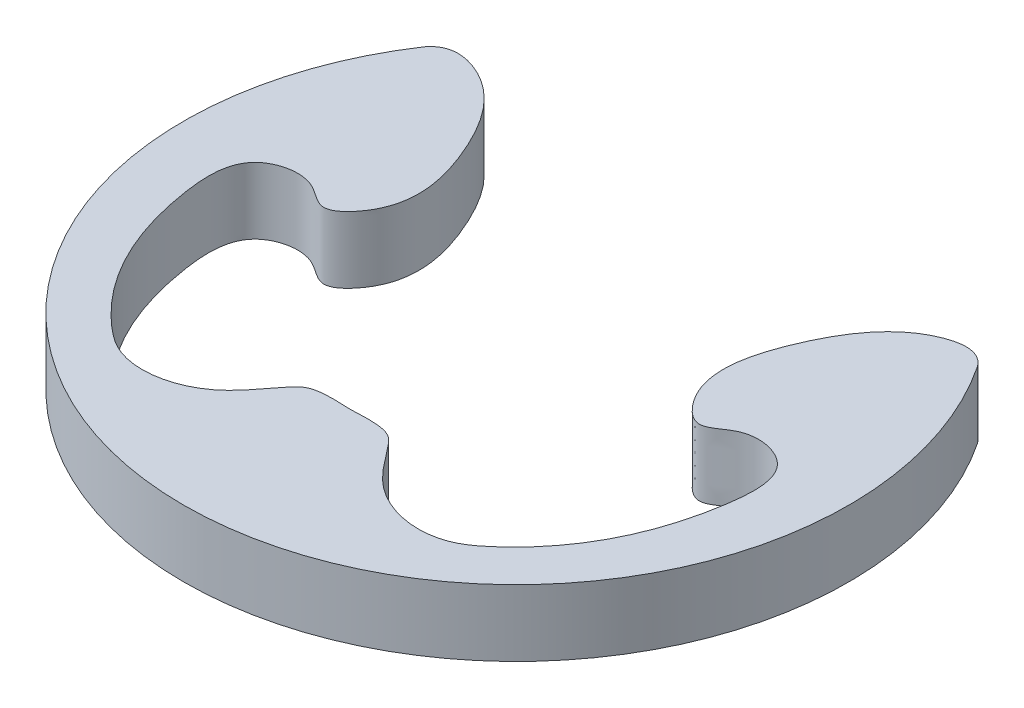
ISO-10303-21;
HEADER;
FILE_DESCRIPTION(('STEP AP214'),'2;1');
FILE_NAME('part.step','',(''),(''),'','','');
FILE_SCHEMA(('AUTOMOTIVE_DESIGN { 1 0 10303 214 1 1 1 1 }'));
ENDSEC;
DATA;
#1=APPLICATION_CONTEXT('core data for automotive mechanical design processes');
#2=APPLICATION_PROTOCOL_DEFINITION('international standard','automotive_design',2000,#1);
#3=PRODUCT_CONTEXT('',#1,'mechanical');
#4=PRODUCT('Part','Part','',(#3));
#5=PRODUCT_RELATED_PRODUCT_CATEGORY('part','',(#4));
#6=PRODUCT_DEFINITION_FORMATION('','',#4);
#7=PRODUCT_DEFINITION_CONTEXT('part definition',#1,'design');
#8=PRODUCT_DEFINITION('design','',#6,#7);
#9=PRODUCT_DEFINITION_SHAPE('','',#8);
#10=(LENGTH_UNIT() NAMED_UNIT(*) SI_UNIT(.MILLI.,.METRE.));
#11=(NAMED_UNIT(*) PLANE_ANGLE_UNIT() SI_UNIT($,.RADIAN.));
#12=(NAMED_UNIT(*) SI_UNIT($,.STERADIAN.) SOLID_ANGLE_UNIT());
#13=UNCERTAINTY_MEASURE_WITH_UNIT(LENGTH_MEASURE(1.E-05),#10,'distance_accuracy_value','');
#14=(GEOMETRIC_REPRESENTATION_CONTEXT(3) GLOBAL_UNCERTAINTY_ASSIGNED_CONTEXT((#13)) GLOBAL_UNIT_ASSIGNED_CONTEXT((#10,
#11,#12)) REPRESENTATION_CONTEXT('',''));
#15=CARTESIAN_POINT('',(0.,0.,0.));
#16=DIRECTION('',(0.,0.,1.));
#17=DIRECTION('',(1.,0.,0.));
#18=AXIS2_PLACEMENT_3D('',#15,#16,#17);
#19=CARTESIAN_POINT('',(0.,0.4,0.));
#20=DIRECTION('',(0.,-1.,0.));
#21=DIRECTION('',(0.,0.,-1.));
#22=AXIS2_PLACEMENT_3D('',#19,#20,#21);
#23=CYLINDRICAL_SURFACE('',#22,2.);
#24=DIRECTION('',(0.,1.,0.));
#25=VECTOR('',#24,1.);
#26=CARTESIAN_POINT('',(-1.66387063278989,-0.00100000000000002,-1.1097452488474));
#27=LINE('',#26,#25);
#28=CARTESIAN_POINT('',(-1.66387063278989,0.,-1.1097452488474));
#29=VERTEX_POINT('',#28);
#30=CARTESIAN_POINT('',(-1.66387063278989,0.4,-1.1097452488474));
#31=VERTEX_POINT('',#30);
#32=EDGE_CURVE('E77',#29,#31,#27,.T.);
#33=ORIENTED_EDGE('',*,*,#32,.F.);
#34=CARTESIAN_POINT('',(0.,0.,0.));
#35=DIRECTION('',(0.,1.,0.));
#36=DIRECTION('',(0.,0.,1.));
#37=AXIS2_PLACEMENT_3D('',#34,#35,#36);
#38=CIRCLE('',#37,2.);
#39=CARTESIAN_POINT('',(1.66387063279339,0.,-1.10974524884214));
#40=VERTEX_POINT('',#39);
#41=EDGE_CURVE('E35',#29,#40,#38,.T.);
#42=ORIENTED_EDGE('',*,*,#41,.T.);
#43=DIRECTION('',(0.,1.,0.));
#44=VECTOR('',#43,1.);
#45=CARTESIAN_POINT('',(1.66387063279339,-0.00100000000000002,-1.10974524884214));
#46=LINE('',#45,#44);
#47=CARTESIAN_POINT('',(1.66387063279339,0.4,-1.10974524884214));
#48=VERTEX_POINT('',#47);
#49=EDGE_CURVE('E46',#40,#48,#46,.T.);
#50=ORIENTED_EDGE('',*,*,#49,.T.);
#51=CARTESIAN_POINT('',(0.,0.4,0.));
#52=DIRECTION('',(0.,1.,0.));
#53=DIRECTION('',(0.,0.,1.));
#54=AXIS2_PLACEMENT_3D('',#51,#52,#53);
#55=CIRCLE('',#54,2.);
#56=EDGE_CURVE('E11',#31,#48,#55,.T.);
#57=ORIENTED_EDGE('',*,*,#56,.F.);
#58=EDGE_LOOP('',(#33,#42,#50,#57));
#59=FACE_BOUND('',#58,.T.);
#60=ADVANCED_FACE('F32',(#59),#23,.T.);
#61=CARTESIAN_POINT('',(0.,0.4,0.));
#62=DIRECTION('',(0.,1.,0.));
#63=DIRECTION('',(0.,0.,1.));
#64=AXIS2_PLACEMENT_3D('',#61,#62,#63);
#65=PLANE('',#64);
#66=CARTESIAN_POINT('',(0.,0.4,1.));
#67=CARTESIAN_POINT('',(0.208250964654716,0.4,0.988236239681564));
#68=CARTESIAN_POINT('',(0.285688156294142,0.4,1.02516274319363));
#69=CARTESIAN_POINT('',(0.516134817375853,0.4,1.39503429082108));
#70=CARTESIAN_POINT('',(0.91926636645246,0.4,1.46711692685205));
#71=CARTESIAN_POINT('',(1.3832942134546,0.4,1.10548122895137));
#72=CARTESIAN_POINT('',(1.62353256504432,0.4,0.635686702454152));
#73=CARTESIAN_POINT('',(1.66088727227594,0.4,-0.0310211682091904));
#74=CARTESIAN_POINT('',(1.30565381602247,0.4,-0.110584822790635));
#75=CARTESIAN_POINT('',(1.1335581885044,0.4,0.0762213385110614));
#76=CARTESIAN_POINT('',(0.849044475231734,0.4,-0.19239276052432));
#77=CARTESIAN_POINT('',(0.965822076869781,0.4,-0.70348139541722));
#78=CARTESIAN_POINT('',(1.26974875374683,0.4,-1.16156105120231));
#79=CARTESIAN_POINT('',(1.61256870819876,0.4,-1.20211968353707));
#80=CARTESIAN_POINT('',(1.67928899196226,0.4,-1.08627274727592));
#81=B_SPLINE_CURVE_WITH_KNOTS('',3,(#66,#67,#68,#69,#70,#71,#72,#73,#74,#75,#76,#77,#78,#79,
#80),.UNSPECIFIED.,.F.,.F.,(4,1,1,1,1,1,1,1,1,1,1,1,4),(0.,0.0628856925943503,0.124135561130469,
0.231355194489178,0.267285205964287,0.479704211720058,0.555549734124641,0.615510884405595,
0.651079781072618,0.684138155509871,0.81014685733678,0.937553871344105,1.),.UNSPECIFIED.);
#82=CARTESIAN_POINT('',(0.,0.4,1.));
#83=VERTEX_POINT('',#82);
#84=EDGE_CURVE('E70',#83,#48,#81,.T.);
#85=ORIENTED_EDGE('',*,*,#84,.F.);
#86=CARTESIAN_POINT('',(0.,0.4,1.));
#87=CARTESIAN_POINT('',(-0.208250964654715,0.4,0.988236239681564));
#88=CARTESIAN_POINT('',(-0.285688156294141,0.4,1.02516274319363));
#89=CARTESIAN_POINT('',(-0.516134817375852,0.4,1.39503429082108));
#90=CARTESIAN_POINT('',(-0.919266366452459,0.4,1.46711692685205));
#91=CARTESIAN_POINT('',(-1.3832942134546,0.4,1.10548122895138));
#92=CARTESIAN_POINT('',(-1.62353256504432,0.4,0.635686702454152));
#93=CARTESIAN_POINT('',(-1.66088727227594,0.4,-0.03102116820919));
#94=CARTESIAN_POINT('',(-1.30565381602247,0.4,-0.110584822790634));
#95=CARTESIAN_POINT('',(-1.1335581885044,0.4,0.0762213385110617));
#96=CARTESIAN_POINT('',(-0.849044475231733,0.4,-0.19239276052432));
#97=CARTESIAN_POINT('',(-0.965822076869781,0.4,-0.70348139541722));
#98=CARTESIAN_POINT('',(-1.26974875374683,0.4,-1.16156105120231));
#99=CARTESIAN_POINT('',(-1.61256870819876,0.4,-1.20211968353707));
#100=CARTESIAN_POINT('',(-1.67928899196226,0.4,-1.08627274727592));
#101=B_SPLINE_CURVE_WITH_KNOTS('',3,(#86,#87,#88,#89,#90,#91,#92,#93,#94,#95,#96,#97,#98,#99,
#100),.UNSPECIFIED.,.F.,.F.,(4,1,1,1,1,1,1,1,1,1,1,1,4),(0.,0.0628856925943503,
0.124135561130469,0.231355194489178,0.267285205964287,0.479704211720058,0.555549734124641,
0.615510884405595,0.651079781072618,0.684138155509871,0.81014685733678,0.937553871344105,1.),.UNSPECIFIED.);
#102=EDGE_CURVE('E68',#83,#31,#101,.T.);
#103=ORIENTED_EDGE('',*,*,#102,.T.);
#104=ORIENTED_EDGE('',*,*,#56,.T.);
#105=EDGE_LOOP('',(#85,#103,#104));
#106=FACE_BOUND('',#105,.T.);
#107=ADVANCED_FACE('F102',(#106),#65,.T.);
#108=CARTESIAN_POINT('',(0.,0.,0.));
#109=DIRECTION('',(0.,1.,0.));
#110=DIRECTION('',(0.,0.,1.));
#111=AXIS2_PLACEMENT_3D('',#108,#109,#110);
#112=PLANE('',#111);
#113=CARTESIAN_POINT('',(0.,0.,1.));
#114=CARTESIAN_POINT('',(-0.208250964654715,0.,0.988236239681564));
#115=CARTESIAN_POINT('',(-0.285688156294141,0.,1.02516274319363));
#116=CARTESIAN_POINT('',(-0.516134817375852,0.,1.39503429082108));
#117=CARTESIAN_POINT('',(-0.919266366452459,0.,1.46711692685205));
#118=CARTESIAN_POINT('',(-1.3832942134546,0.,1.10548122895138));
#119=CARTESIAN_POINT('',(-1.62353256504432,0.,0.635686702454152));
#120=CARTESIAN_POINT('',(-1.66088727227594,0.,-0.03102116820919));
#121=CARTESIAN_POINT('',(-1.30565381602247,0.,-0.110584822790634));
#122=CARTESIAN_POINT('',(-1.1335581885044,0.,0.0762213385110617));
#123=CARTESIAN_POINT('',(-0.849044475231733,0.,-0.19239276052432));
#124=CARTESIAN_POINT('',(-0.965822076869781,0.,-0.70348139541722));
#125=CARTESIAN_POINT('',(-1.26974875374683,0.,-1.16156105120231));
#126=CARTESIAN_POINT('',(-1.61256870819876,0.,-1.20211968353707));
#127=CARTESIAN_POINT('',(-1.67928899196226,0.,-1.08627274727592));
#128=B_SPLINE_CURVE_WITH_KNOTS('',3,(#113,#114,#115,#116,#117,#118,#119,#120,#121,#122,#123,
#124,#125,#126,#127),.UNSPECIFIED.,.F.,.F.,(4,1,1,1,1,1,1,1,1,1,1,1,4),(0.,0.0628856925943503,
0.124135561130469,0.231355194489178,0.267285205964287,0.479704211720058,0.555549734124641,
0.615510884405595,0.651079781072618,0.684138155509871,0.81014685733678,0.937553871344105,1.),.UNSPECIFIED.);
#129=CARTESIAN_POINT('',(0.,0.,1.));
#130=VERTEX_POINT('',#129);
#131=EDGE_CURVE('E54',#29,#130,#128,.F.);
#132=ORIENTED_EDGE('',*,*,#131,.T.);
#133=CARTESIAN_POINT('',(0.,0.,1.));
#134=CARTESIAN_POINT('',(0.208250964654716,0.,0.988236239681564));
#135=CARTESIAN_POINT('',(0.285688156294142,0.,1.02516274319363));
#136=CARTESIAN_POINT('',(0.516134817375853,0.,1.39503429082108));
#137=CARTESIAN_POINT('',(0.91926636645246,0.,1.46711692685205));
#138=CARTESIAN_POINT('',(1.3832942134546,0.,1.10548122895137));
#139=CARTESIAN_POINT('',(1.62353256504432,0.,0.635686702454152));
#140=CARTESIAN_POINT('',(1.66088727227594,0.,-0.0310211682091904));
#141=CARTESIAN_POINT('',(1.30565381602247,0.,-0.110584822790635));
#142=CARTESIAN_POINT('',(1.1335581885044,0.,0.0762213385110614));
#143=CARTESIAN_POINT('',(0.849044475231734,0.,-0.19239276052432));
#144=CARTESIAN_POINT('',(0.965822076869781,0.,-0.70348139541722));
#145=CARTESIAN_POINT('',(1.26974875374683,0.,-1.16156105120231));
#146=CARTESIAN_POINT('',(1.61256870819876,0.,-1.20211968353707));
#147=CARTESIAN_POINT('',(1.67928899196226,0.,-1.08627274727592));
#148=B_SPLINE_CURVE_WITH_KNOTS('',3,(#133,#134,#135,#136,#137,#138,#139,#140,#141,#142,#143,
#144,#145,#146,#147),.UNSPECIFIED.,.F.,.F.,(4,1,1,1,1,1,1,1,1,1,1,1,4),(0.,0.0628856925943503,
0.124135561130469,0.231355194489178,0.267285205964287,0.479704211720058,0.555549734124641,
0.615510884405595,0.651079781072618,0.684138155509871,0.81014685733678,0.937553871344105,1.),.UNSPECIFIED.);
#149=EDGE_CURVE('E72',#40,#130,#148,.F.);
#150=ORIENTED_EDGE('',*,*,#149,.F.);
#151=ORIENTED_EDGE('',*,*,#41,.F.);
#152=EDGE_LOOP('',(#132,#150,#151));
#153=FACE_BOUND('',#152,.T.);
#154=ADVANCED_FACE('F79',(#153),#112,.F.);
#155=CARTESIAN_POINT('',(0.,-0.00100000000000002,1.));
#156=CARTESIAN_POINT('',(-0.208250964654715,-0.00100000000000002,0.988236239681564));
#157=CARTESIAN_POINT('',(-0.285688156294141,-0.00100000000000002,1.02516274319363));
#158=CARTESIAN_POINT('',(-0.516134817375852,-0.00100000000000002,1.39503429082108));
#159=CARTESIAN_POINT('',(-0.919266366452459,-0.00100000000000002,1.46711692685205));
#160=CARTESIAN_POINT('',(-1.3832942134546,-0.00100000000000002,1.10548122895138));
#161=CARTESIAN_POINT('',(-1.62353256504432,-0.00100000000000002,0.635686702454152));
#162=CARTESIAN_POINT('',(-1.66088727227594,-0.00100000000000002,-0.03102116820919));
#163=CARTESIAN_POINT('',(-1.30565381602247,-0.00100000000000002,-0.110584822790634));
#164=CARTESIAN_POINT('',(-1.1335581885044,-0.00100000000000002,0.0762213385110617));
#165=CARTESIAN_POINT('',(-0.849044475231733,-0.00100000000000002,-0.19239276052432));
#166=CARTESIAN_POINT('',(-0.965822076869781,-0.00100000000000002,-0.70348139541722));
#167=CARTESIAN_POINT('',(-1.26974875374683,-0.00100000000000002,-1.16156105120231));
#168=CARTESIAN_POINT('',(-1.61256870819876,-0.00100000000000002,-1.20211968353707));
#169=CARTESIAN_POINT('',(-1.67928899196226,-0.00100000000000002,-1.08627274727592));
#170=B_SPLINE_CURVE_WITH_KNOTS('',3,(#155,#156,#157,#158,#159,#160,#161,#162,#163,#164,#165,
#166,#167,#168,#169),.UNSPECIFIED.,.F.,.F.,(4,1,1,1,1,1,1,1,1,1,1,1,4),(0.,0.0628856925943503,
0.124135561130469,0.231355194489178,0.267285205964287,0.479704211720058,0.555549734124641,
0.615510884405595,0.651079781072618,0.684138155509871,0.81014685733678,0.937553871344105,1.),.UNSPECIFIED.);
#171=DIRECTION('',(0.,1.,0.));
#172=VECTOR('',#171,1.);
#173=SURFACE_OF_LINEAR_EXTRUSION('',#170,#172);
#174=ORIENTED_EDGE('',*,*,#32,.T.);
#175=ORIENTED_EDGE('',*,*,#102,.F.);
#176=DIRECTION('',(0.,1.,0.));
#177=VECTOR('',#176,1.);
#178=CARTESIAN_POINT('',(0.,-0.00100000000000002,1.));
#179=LINE('',#178,#177);
#180=EDGE_CURVE('E65',#130,#83,#179,.T.);
#181=ORIENTED_EDGE('',*,*,#180,.F.);
#182=ORIENTED_EDGE('',*,*,#131,.F.);
#183=EDGE_LOOP('',(#174,#175,#181,#182));
#184=FACE_BOUND('',#183,.T.);
#185=ADVANCED_FACE('F66',(#184),#173,.T.);
#186=CARTESIAN_POINT('',(0.,-0.00100000000000002,1.));
#187=CARTESIAN_POINT('',(0.208250964654716,-0.00100000000000002,0.988236239681564));
#188=CARTESIAN_POINT('',(0.285688156294142,-0.00100000000000002,1.02516274319363));
#189=CARTESIAN_POINT('',(0.516134817375853,-0.00100000000000002,1.39503429082108));
#190=CARTESIAN_POINT('',(0.91926636645246,-0.00100000000000002,1.46711692685205));
#191=CARTESIAN_POINT('',(1.3832942134546,-0.00100000000000002,1.10548122895137));
#192=CARTESIAN_POINT('',(1.62353256504432,-0.00100000000000002,0.635686702454152));
#193=CARTESIAN_POINT('',(1.66088727227594,-0.00100000000000002,-0.0310211682091904));
#194=CARTESIAN_POINT('',(1.30565381602247,-0.00100000000000002,-0.110584822790635));
#195=CARTESIAN_POINT('',(1.1335581885044,-0.00100000000000002,0.0762213385110614));
#196=CARTESIAN_POINT('',(0.849044475231734,-0.00100000000000002,-0.19239276052432));
#197=CARTESIAN_POINT('',(0.965822076869781,-0.00100000000000002,-0.70348139541722));
#198=CARTESIAN_POINT('',(1.26974875374683,-0.00100000000000002,-1.16156105120231));
#199=CARTESIAN_POINT('',(1.61256870819876,-0.00100000000000002,-1.20211968353707));
#200=CARTESIAN_POINT('',(1.67928899196226,-0.00100000000000002,-1.08627274727592));
#201=B_SPLINE_CURVE_WITH_KNOTS('',3,(#186,#187,#188,#189,#190,#191,#192,#193,#194,#195,#196,
#197,#198,#199,#200),.UNSPECIFIED.,.F.,.F.,(4,1,1,1,1,1,1,1,1,1,1,1,4),(0.,0.0628856925943503,
0.124135561130469,0.231355194489178,0.267285205964287,0.479704211720058,0.555549734124641,
0.615510884405595,0.651079781072618,0.684138155509871,0.81014685733678,0.937553871344105,1.),.UNSPECIFIED.);
#202=DIRECTION('',(0.,1.,0.));
#203=VECTOR('',#202,1.);
#204=SURFACE_OF_LINEAR_EXTRUSION('',#201,#203);
#205=ORIENTED_EDGE('',*,*,#149,.T.);
#206=ORIENTED_EDGE('',*,*,#180,.T.);
#207=ORIENTED_EDGE('',*,*,#84,.T.);
#208=ORIENTED_EDGE('',*,*,#49,.F.);
#209=EDGE_LOOP('',(#205,#206,#207,#208));
#210=FACE_BOUND('',#209,.T.);
#211=ADVANCED_FACE('F73',(#210),#204,.F.);
#212=CLOSED_SHELL('',(#60,#107,#154,#185,#211));
#213=MANIFOLD_SOLID_BREP('B2',#212);
#214=ADVANCED_BREP_SHAPE_REPRESENTATION('',(#18,#213),#14);
#215=SHAPE_DEFINITION_REPRESENTATION(#9,#214);
ENDSEC;
END-ISO-10303-21;
